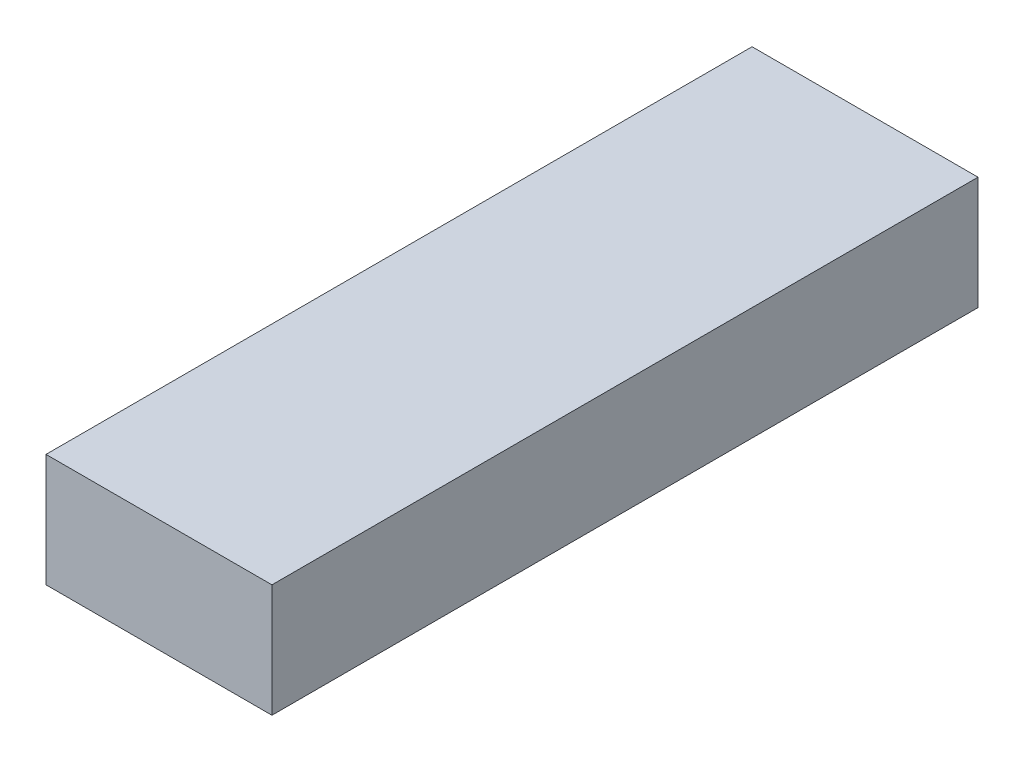
ISO-10303-21;
HEADER;
FILE_DESCRIPTION(('STEP AP214'),'2;1');
FILE_NAME('part.step','',(''),(''),'','','');
FILE_SCHEMA(('AUTOMOTIVE_DESIGN { 1 0 10303 214 1 1 1 1 }'));
ENDSEC;
DATA;
#1=APPLICATION_CONTEXT('core data for automotive mechanical design processes');
#2=APPLICATION_PROTOCOL_DEFINITION('international standard','automotive_design',2000,#1);
#3=PRODUCT_CONTEXT('',#1,'mechanical');
#4=PRODUCT('Part','Part','',(#3));
#5=PRODUCT_RELATED_PRODUCT_CATEGORY('part','',(#4));
#6=PRODUCT_DEFINITION_FORMATION('','',#4);
#7=PRODUCT_DEFINITION_CONTEXT('part definition',#1,'design');
#8=PRODUCT_DEFINITION('design','',#6,#7);
#9=PRODUCT_DEFINITION_SHAPE('','',#8);
#10=(LENGTH_UNIT() NAMED_UNIT(*) SI_UNIT(.MILLI.,.METRE.));
#11=(NAMED_UNIT(*) PLANE_ANGLE_UNIT() SI_UNIT($,.RADIAN.));
#12=(NAMED_UNIT(*) SI_UNIT($,.STERADIAN.) SOLID_ANGLE_UNIT());
#13=UNCERTAINTY_MEASURE_WITH_UNIT(LENGTH_MEASURE(1.E-05),#10,'distance_accuracy_value','');
#14=(GEOMETRIC_REPRESENTATION_CONTEXT(3) GLOBAL_UNCERTAINTY_ASSIGNED_CONTEXT((#13)) GLOBAL_UNIT_ASSIGNED_CONTEXT((#10,
#11,#12)) REPRESENTATION_CONTEXT('',''));
#15=CARTESIAN_POINT('',(0.,0.,0.));
#16=DIRECTION('',(0.,0.,1.));
#17=DIRECTION('',(1.,0.,0.));
#18=AXIS2_PLACEMENT_3D('',#15,#16,#17);
#19=CARTESIAN_POINT('',(50.8,25.4,317.5));
#20=DIRECTION('',(-1.,0.,0.));
#21=DIRECTION('',(0.,-1.,0.));
#22=AXIS2_PLACEMENT_3D('',#19,#20,#21);
#23=PLANE('',#22);
#24=DIRECTION('',(0.,1.,0.));
#25=VECTOR('',#24,1.);
#26=CARTESIAN_POINT('',(50.8,25.4,0.));
#27=LINE('',#26,#25);
#28=CARTESIAN_POINT('',(50.8,-25.4,0.));
#29=VERTEX_POINT('',#28);
#30=CARTESIAN_POINT('',(50.8,25.4,0.));
#31=VERTEX_POINT('',#30);
#32=EDGE_CURVE('E96',#29,#31,#27,.T.);
#33=ORIENTED_EDGE('',*,*,#32,.T.);
#34=DIRECTION('',(0.,0.,-1.));
#35=VECTOR('',#34,1.);
#36=CARTESIAN_POINT('',(50.8,25.4,317.5));
#37=LINE('',#36,#35);
#38=CARTESIAN_POINT('',(50.8,25.4,317.5));
#39=VERTEX_POINT('',#38);
#40=EDGE_CURVE('E11',#39,#31,#37,.T.);
#41=ORIENTED_EDGE('',*,*,#40,.F.);
#42=DIRECTION('',(0.,1.,0.));
#43=VECTOR('',#42,1.);
#44=CARTESIAN_POINT('',(50.8,25.4,317.5));
#45=LINE('',#44,#43);
#46=CARTESIAN_POINT('',(50.8,-25.4,317.5));
#47=VERTEX_POINT('',#46);
#48=EDGE_CURVE('E84',#47,#39,#45,.T.);
#49=ORIENTED_EDGE('',*,*,#48,.F.);
#50=DIRECTION('',(0.,0.,-1.));
#51=VECTOR('',#50,1.);
#52=CARTESIAN_POINT('',(50.8,-25.4,317.5));
#53=LINE('',#52,#51);
#54=EDGE_CURVE('E92',#47,#29,#53,.T.);
#55=ORIENTED_EDGE('',*,*,#54,.T.);
#56=EDGE_LOOP('',(#33,#41,#49,#55));
#57=FACE_BOUND('',#56,.T.);
#58=ADVANCED_FACE('F33',(#57),#23,.F.);
#59=CARTESIAN_POINT('',(-50.8,25.4,317.5));
#60=DIRECTION('',(0.,-1.,0.));
#61=DIRECTION('',(0.,0.,-1.));
#62=AXIS2_PLACEMENT_3D('',#59,#60,#61);
#63=PLANE('',#62);
#64=DIRECTION('',(-1.,0.,0.));
#65=VECTOR('',#64,1.);
#66=CARTESIAN_POINT('',(-50.8,25.4,0.));
#67=LINE('',#66,#65);
#68=CARTESIAN_POINT('',(-50.8,25.4,0.));
#69=VERTEX_POINT('',#68);
#70=EDGE_CURVE('E88',#31,#69,#67,.T.);
#71=ORIENTED_EDGE('',*,*,#70,.T.);
#72=DIRECTION('',(0.,0.,-1.));
#73=VECTOR('',#72,1.);
#74=CARTESIAN_POINT('',(-50.8,25.4,317.5));
#75=LINE('',#74,#73);
#76=CARTESIAN_POINT('',(-50.8,25.4,317.5));
#77=VERTEX_POINT('',#76);
#78=EDGE_CURVE('E41',#77,#69,#75,.T.);
#79=ORIENTED_EDGE('',*,*,#78,.F.);
#80=DIRECTION('',(-1.,0.,0.));
#81=VECTOR('',#80,1.);
#82=CARTESIAN_POINT('',(-50.8,25.4,317.5));
#83=LINE('',#82,#81);
#84=EDGE_CURVE('E79',#39,#77,#83,.T.);
#85=ORIENTED_EDGE('',*,*,#84,.F.);
#86=ORIENTED_EDGE('',*,*,#40,.T.);
#87=EDGE_LOOP('',(#71,#79,#85,#86));
#88=FACE_BOUND('',#87,.T.);
#89=ADVANCED_FACE('F87',(#88),#63,.F.);
#90=CARTESIAN_POINT('',(-50.8,25.4,317.5));
#91=DIRECTION('',(1.,0.,0.));
#92=DIRECTION('',(0.,1.,0.));
#93=AXIS2_PLACEMENT_3D('',#90,#91,#92);
#94=PLANE('',#93);
#95=DIRECTION('',(0.,-1.,0.));
#96=VECTOR('',#95,1.);
#97=CARTESIAN_POINT('',(-50.8,25.4,0.));
#98=LINE('',#97,#96);
#99=CARTESIAN_POINT('',(-50.8,-25.4,0.));
#100=VERTEX_POINT('',#99);
#101=EDGE_CURVE('E66',#69,#100,#98,.T.);
#102=ORIENTED_EDGE('',*,*,#101,.T.);
#103=DIRECTION('',(0.,0.,-1.));
#104=VECTOR('',#103,1.);
#105=CARTESIAN_POINT('',(-50.8,-25.4,317.5));
#106=LINE('',#105,#104);
#107=CARTESIAN_POINT('',(-50.8,-25.4,317.5));
#108=VERTEX_POINT('',#107);
#109=EDGE_CURVE('E89',#108,#100,#106,.T.);
#110=ORIENTED_EDGE('',*,*,#109,.F.);
#111=DIRECTION('',(0.,-1.,0.));
#112=VECTOR('',#111,1.);
#113=CARTESIAN_POINT('',(-50.8,25.4,317.5));
#114=LINE('',#113,#112);
#115=EDGE_CURVE('E82',#77,#108,#114,.T.);
#116=ORIENTED_EDGE('',*,*,#115,.F.);
#117=ORIENTED_EDGE('',*,*,#78,.T.);
#118=EDGE_LOOP('',(#102,#110,#116,#117));
#119=FACE_BOUND('',#118,.T.);
#120=ADVANCED_FACE('F90',(#119),#94,.F.);
#121=CARTESIAN_POINT('',(-50.8,-25.4,317.5));
#122=DIRECTION('',(0.,1.,0.));
#123=DIRECTION('',(0.,0.,1.));
#124=AXIS2_PLACEMENT_3D('',#121,#122,#123);
#125=PLANE('',#124);
#126=DIRECTION('',(1.,0.,0.));
#127=VECTOR('',#126,1.);
#128=CARTESIAN_POINT('',(-50.8,-25.4,0.));
#129=LINE('',#128,#127);
#130=EDGE_CURVE('E72',#100,#29,#129,.T.);
#131=ORIENTED_EDGE('',*,*,#130,.T.);
#132=ORIENTED_EDGE('',*,*,#54,.F.);
#133=DIRECTION('',(1.,0.,0.));
#134=VECTOR('',#133,1.);
#135=CARTESIAN_POINT('',(-50.8,-25.4,317.5));
#136=LINE('',#135,#134);
#137=EDGE_CURVE('E49',#108,#47,#136,.T.);
#138=ORIENTED_EDGE('',*,*,#137,.F.);
#139=ORIENTED_EDGE('',*,*,#109,.T.);
#140=EDGE_LOOP('',(#131,#132,#138,#139));
#141=FACE_BOUND('',#140,.T.);
#142=ADVANCED_FACE('F103',(#141),#125,.F.);
#143=CARTESIAN_POINT('',(0.,0.,317.5));
#144=DIRECTION('',(0.,0.,1.));
#145=DIRECTION('',(1.,0.,0.));
#146=AXIS2_PLACEMENT_3D('',#143,#144,#145);
#147=PLANE('',#146);
#148=ORIENTED_EDGE('',*,*,#48,.T.);
#149=ORIENTED_EDGE('',*,*,#84,.T.);
#150=ORIENTED_EDGE('',*,*,#115,.T.);
#151=ORIENTED_EDGE('',*,*,#137,.T.);
#152=EDGE_LOOP('',(#148,#149,#150,#151));
#153=FACE_BOUND('',#152,.T.);
#154=ADVANCED_FACE('F80',(#153),#147,.T.);
#155=CARTESIAN_POINT('',(0.,0.,0.));
#156=DIRECTION('',(0.,0.,1.));
#157=DIRECTION('',(1.,0.,0.));
#158=AXIS2_PLACEMENT_3D('',#155,#156,#157);
#159=PLANE('',#158);
#160=ORIENTED_EDGE('',*,*,#32,.F.);
#161=ORIENTED_EDGE('',*,*,#130,.F.);
#162=ORIENTED_EDGE('',*,*,#101,.F.);
#163=ORIENTED_EDGE('',*,*,#70,.F.);
#164=EDGE_LOOP('',(#160,#161,#162,#163));
#165=FACE_BOUND('',#164,.T.);
#166=ADVANCED_FACE('F106',(#165),#159,.F.);
#167=CLOSED_SHELL('',(#58,#89,#120,#142,#154,#166));
#168=MANIFOLD_SOLID_BREP('B2',#167);
#169=ADVANCED_BREP_SHAPE_REPRESENTATION('',(#18,#168),#14);
#170=SHAPE_DEFINITION_REPRESENTATION(#9,#169);
ENDSEC;
END-ISO-10303-21;
